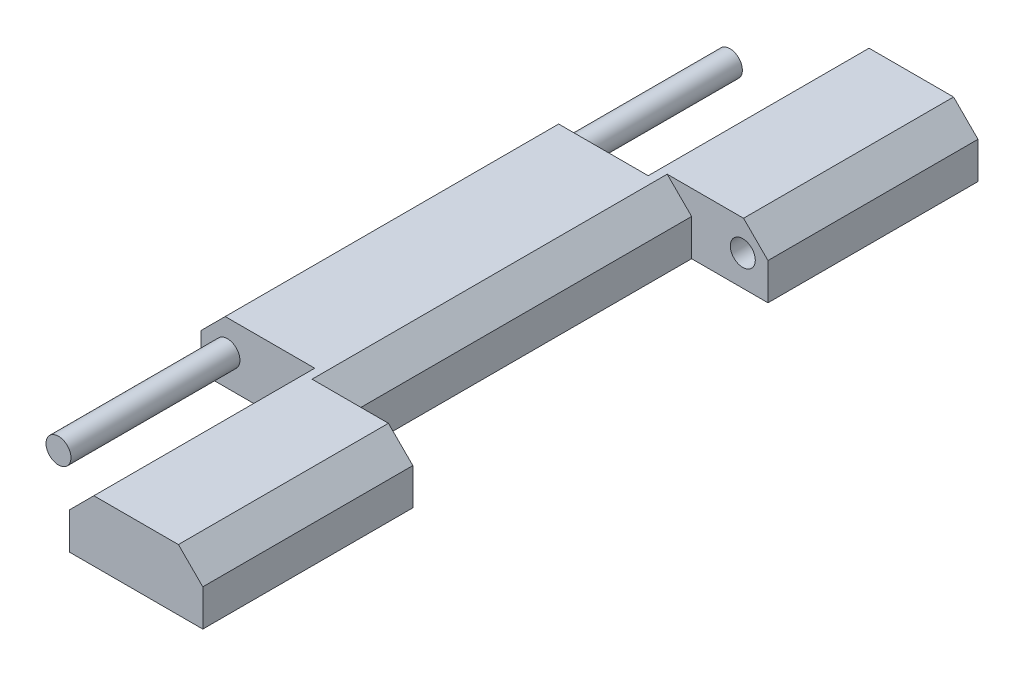
ISO-10303-21;
HEADER;
FILE_DESCRIPTION(('STEP AP214'),'2;1');
FILE_NAME('part.step','',(''),(''),'','','');
FILE_SCHEMA(('AUTOMOTIVE_DESIGN { 1 0 10303 214 1 1 1 1 }'));
ENDSEC;
DATA;
#1=APPLICATION_CONTEXT('core data for automotive mechanical design processes');
#2=APPLICATION_PROTOCOL_DEFINITION('international standard','automotive_design',2000,#1);
#3=PRODUCT_CONTEXT('',#1,'mechanical');
#4=PRODUCT('Part','Part','',(#3));
#5=PRODUCT_RELATED_PRODUCT_CATEGORY('part','',(#4));
#6=PRODUCT_DEFINITION_FORMATION('','',#4);
#7=PRODUCT_DEFINITION_CONTEXT('part definition',#1,'design');
#8=PRODUCT_DEFINITION('design','',#6,#7);
#9=PRODUCT_DEFINITION_SHAPE('','',#8);
#10=(LENGTH_UNIT() NAMED_UNIT(*) SI_UNIT(.MILLI.,.METRE.));
#11=(NAMED_UNIT(*) PLANE_ANGLE_UNIT() SI_UNIT($,.RADIAN.));
#12=(NAMED_UNIT(*) SI_UNIT($,.STERADIAN.) SOLID_ANGLE_UNIT());
#13=UNCERTAINTY_MEASURE_WITH_UNIT(LENGTH_MEASURE(1.E-05),#10,'distance_accuracy_value','');
#14=(GEOMETRIC_REPRESENTATION_CONTEXT(3) GLOBAL_UNCERTAINTY_ASSIGNED_CONTEXT((#13)) GLOBAL_UNIT_ASSIGNED_CONTEXT((#10,
#11,#12)) REPRESENTATION_CONTEXT('',''));
#15=CARTESIAN_POINT('',(0.,0.,0.));
#16=DIRECTION('',(0.,0.,1.));
#17=DIRECTION('',(1.,0.,0.));
#18=AXIS2_PLACEMENT_3D('',#15,#16,#17);
#19=CARTESIAN_POINT('',(-6.13161438081057,5.92420723275193,42.8625));
#20=DIRECTION('',(0.,0.,-1.));
#21=DIRECTION('',(-1.,0.,0.));
#22=AXIS2_PLACEMENT_3D('',#19,#20,#21);
#23=PLANE('',#22);
#24=DIRECTION('',(0.,-1.,0.));
#25=VECTOR('',#24,1.);
#26=CARTESIAN_POINT('',(8.61607262485704,5.92420723275193,42.8625));
#27=LINE('',#26,#25);
#28=CARTESIAN_POINT('',(8.61607262485704,3.22420723275193,42.8625));
#29=VERTEX_POINT('',#28);
#30=CARTESIAN_POINT('',(8.61607262485704,-0.825792767248064,42.8625));
#31=VERTEX_POINT('',#30);
#32=EDGE_CURVE('E162',#29,#31,#27,.T.);
#33=ORIENTED_EDGE('',*,*,#32,.F.);
#34=DIRECTION('',(0.707106781186548,-0.707106781186548,0.));
#35=VECTOR('',#34,1.);
#36=CARTESIAN_POINT('',(5.91607262485758,5.92420723275139,42.8625));
#37=LINE('',#36,#35);
#38=CARTESIAN_POINT('',(5.91607262485704,5.92420723275193,42.8625));
#39=VERTEX_POINT('',#38);
#40=EDGE_CURVE('E279',#29,#39,#37,.F.);
#41=ORIENTED_EDGE('',*,*,#40,.T.);
#42=DIRECTION('',(1.,0.,0.));
#43=VECTOR('',#42,1.);
#44=CARTESIAN_POINT('',(-6.13161438081057,5.92420723275193,42.8625));
#45=LINE('',#44,#43);
#46=CARTESIAN_POINT('',(-3.43161438081057,5.92420723275193,42.8625));
#47=VERTEX_POINT('',#46);
#48=EDGE_CURVE('E224',#47,#39,#45,.T.);
#49=ORIENTED_EDGE('',*,*,#48,.F.);
#50=DIRECTION('',(0.707106781186548,0.707106781186548,0.));
#51=VECTOR('',#50,1.);
#52=CARTESIAN_POINT('',(-3.43161438081056,5.92420723275195,42.8625));
#53=LINE('',#52,#51);
#54=CARTESIAN_POINT('',(-6.13161438081057,3.22420723275193,42.8625));
#55=VERTEX_POINT('',#54);
#56=EDGE_CURVE('E277',#47,#55,#53,.F.);
#57=ORIENTED_EDGE('',*,*,#56,.T.);
#58=DIRECTION('',(0.,-1.,0.));
#59=VECTOR('',#58,1.);
#60=CARTESIAN_POINT('',(-6.13161438081057,5.92420723275193,42.8625));
#61=LINE('',#60,#59);
#62=CARTESIAN_POINT('',(-6.13161438081057,-0.825792767248064,42.8625));
#63=VERTEX_POINT('',#62);
#64=EDGE_CURVE('E186',#55,#63,#61,.T.);
#65=ORIENTED_EDGE('',*,*,#64,.T.);
#66=DIRECTION('',(1.,0.,0.));
#67=VECTOR('',#66,1.);
#68=CARTESIAN_POINT('',(-6.13161438081057,-0.825792767248064,42.8625));
#69=LINE('',#68,#67);
#70=EDGE_CURVE('E180',#63,#31,#69,.T.);
#71=ORIENTED_EDGE('',*,*,#70,.T.);
#72=EDGE_LOOP('',(#33,#41,#49,#57,#65,#71));
#73=FACE_BOUND('',#72,.T.);
#74=ADVANCED_FACE('F35',(#73),#23,.F.);
#75=CARTESIAN_POINT('',(8.61607262485762,5.92420723275193,19.6362347014294));
#76=DIRECTION('',(-1.,0.,0.));
#77=DIRECTION('',(0.,0.,1.));
#78=AXIS2_PLACEMENT_3D('',#75,#76,#77);
#79=PLANE('',#78);
#80=DIRECTION('',(0.,-1.,0.));
#81=VECTOR('',#80,1.);
#82=CARTESIAN_POINT('',(8.61607262485762,5.92420723275193,19.6362347014294));
#83=LINE('',#82,#81);
#84=CARTESIAN_POINT('',(8.61607262485762,3.22420723275193,19.6362347014294));
#85=VERTEX_POINT('',#84);
#86=CARTESIAN_POINT('',(8.61607262485762,-0.825792767248064,19.6362347014294));
#87=VERTEX_POINT('',#86);
#88=EDGE_CURVE('E174',#85,#87,#83,.T.);
#89=ORIENTED_EDGE('',*,*,#88,.F.);
#90=DIRECTION('',(0.,0.,1.));
#91=VECTOR('',#90,1.);
#92=CARTESIAN_POINT('',(8.61607262485762,3.22420723275193,19.6362347014294));
#93=LINE('',#92,#91);
#94=EDGE_CURVE('E169',#85,#29,#93,.T.);
#95=ORIENTED_EDGE('',*,*,#94,.T.);
#96=ORIENTED_EDGE('',*,*,#32,.T.);
#97=DIRECTION('',(0.,0.,-1.));
#98=VECTOR('',#97,1.);
#99=CARTESIAN_POINT('',(8.61607262485762,-0.825792767248064,19.6362347014294));
#100=LINE('',#99,#98);
#101=EDGE_CURVE('E166',#31,#87,#100,.T.);
#102=ORIENTED_EDGE('',*,*,#101,.T.);
#103=EDGE_LOOP('',(#89,#95,#96,#102));
#104=FACE_BOUND('',#103,.T.);
#105=ADVANCED_FACE('F165',(#104),#79,.F.);
#106=CARTESIAN_POINT('',(8.61607262485762,5.92420723275193,19.6362347014294));
#107=DIRECTION('',(0.,0.,1.));
#108=DIRECTION('',(1.,0.,0.));
#109=AXIS2_PLACEMENT_3D('',#106,#107,#108);
#110=PLANE('',#109);
#111=CARTESIAN_POINT('',(5.8326217708247,2.54920723275193,19.6362347014294));
#112=DIRECTION('',(0.,0.,1.));
#113=DIRECTION('',(1.,0.,0.));
#114=AXIS2_PLACEMENT_3D('',#111,#112,#113);
#115=CIRCLE('',#114,1.37928339962338);
#116=CARTESIAN_POINT('',(7.21190517044808,2.54920723275193,19.6362347014294));
#117=VERTEX_POINT('',#116);
#118=EDGE_CURVE('E302',#117,#117,#115,.F.);
#119=ORIENTED_EDGE('',*,*,#118,.F.);
#120=EDGE_LOOP('',(#119));
#121=FACE_BOUND('',#120,.T.);
#122=DIRECTION('',(-1.,0.,0.));
#123=VECTOR('',#122,1.);
#124=CARTESIAN_POINT('',(8.61607262485762,5.92420723275193,19.6362347014294));
#125=LINE('',#124,#123);
#126=CARTESIAN_POINT('',(5.91607262485761,5.92420723275193,19.6362347014294));
#127=VERTEX_POINT('',#126);
#128=CARTESIAN_POINT('',(-2.52710417271163,5.92420723275193,19.6362347014294));
#129=VERTEX_POINT('',#128);
#130=EDGE_CURVE('E309',#127,#129,#125,.T.);
#131=ORIENTED_EDGE('',*,*,#130,.F.);
#132=DIRECTION('',(-0.707106781186548,0.707106781186548,0.));
#133=VECTOR('',#132,1.);
#134=CARTESIAN_POINT('',(5.91607262485786,5.92420723275169,19.6362347014294));
#135=LINE('',#134,#133);
#136=EDGE_CURVE('E274',#127,#85,#135,.F.);
#137=ORIENTED_EDGE('',*,*,#136,.T.);
#138=ORIENTED_EDGE('',*,*,#88,.T.);
#139=DIRECTION('',(-1.,0.,0.));
#140=VECTOR('',#139,1.);
#141=CARTESIAN_POINT('',(8.61607262485762,-0.825792767248064,19.6362347014294));
#142=LINE('',#141,#140);
#143=CARTESIAN_POINT('',(0.172895827288381,-0.825792767248064,19.6362347014294));
#144=VERTEX_POINT('',#143);
#145=EDGE_CURVE('E183',#87,#144,#142,.T.);
#146=ORIENTED_EDGE('',*,*,#145,.T.);
#147=DIRECTION('',(0.,-1.,0.));
#148=VECTOR('',#147,1.);
#149=CARTESIAN_POINT('',(0.172895827288381,5.92420723275193,19.6362347014294));
#150=LINE('',#149,#148);
#151=CARTESIAN_POINT('',(0.172895827288381,3.22420723275191,19.6362347014294));
#152=VERTEX_POINT('',#151);
#153=EDGE_CURVE('E242',#152,#144,#150,.T.);
#154=ORIENTED_EDGE('',*,*,#153,.F.);
#155=DIRECTION('',(0.707106781186546,-0.707106781186549,0.));
#156=VECTOR('',#155,1.);
#157=CARTESIAN_POINT('',(3.04448422607298,0.352618833967311,19.6362347014294));
#158=LINE('',#157,#156);
#159=EDGE_CURVE('E44',#152,#129,#158,.F.);
#160=ORIENTED_EDGE('',*,*,#159,.T.);
#161=EDGE_LOOP('',(#131,#137,#138,#146,#154,#160));
#162=FACE_BOUND('',#161,.T.);
#163=ADVANCED_FACE('F368',(#121,#162),#110,.F.);
#164=CARTESIAN_POINT('',(0.172895827288381,5.92420723275193,19.6362347014294));
#165=DIRECTION('',(-1.,0.,0.));
#166=DIRECTION('',(0.,0.,1.));
#167=AXIS2_PLACEMENT_3D('',#164,#165,#166);
#168=PLANE('',#167);
#169=DIRECTION('',(0.,-1.,0.));
#170=VECTOR('',#169,1.);
#171=CARTESIAN_POINT('',(0.172895827288381,5.92420723275193,-19.6362347014294));
#172=LINE('',#171,#170);
#173=CARTESIAN_POINT('',(0.172895827288381,3.22420723275191,-19.6362347014294));
#174=VERTEX_POINT('',#173);
#175=CARTESIAN_POINT('',(0.172895827288381,-0.825792767248064,-19.6362347014294));
#176=VERTEX_POINT('',#175);
#177=EDGE_CURVE('E240',#174,#176,#172,.T.);
#178=ORIENTED_EDGE('',*,*,#177,.F.);
#179=DIRECTION('',(0.,0.,1.));
#180=VECTOR('',#179,1.);
#181=CARTESIAN_POINT('',(0.172895827288381,3.22420723275191,19.6362347014294));
#182=LINE('',#181,#180);
#183=EDGE_CURVE('E272',#174,#152,#182,.T.);
#184=ORIENTED_EDGE('',*,*,#183,.T.);
#185=ORIENTED_EDGE('',*,*,#153,.T.);
#186=DIRECTION('',(0.,0.,-1.));
#187=VECTOR('',#186,1.);
#188=CARTESIAN_POINT('',(0.172895827288381,-0.825792767248064,19.6362347014294));
#189=LINE('',#188,#187);
#190=EDGE_CURVE('E198',#144,#176,#189,.T.);
#191=ORIENTED_EDGE('',*,*,#190,.T.);
#192=EDGE_LOOP('',(#178,#184,#185,#191));
#193=FACE_BOUND('',#192,.T.);
#194=ADVANCED_FACE('F363',(#193),#168,.F.);
#195=CARTESIAN_POINT('',(8.61607262485761,5.92420723275193,-19.6362347014294));
#196=DIRECTION('',(0.,0.,-1.));
#197=DIRECTION('',(-1.,0.,0.));
#198=AXIS2_PLACEMENT_3D('',#195,#196,#197);
#199=PLANE('',#198);
#200=CARTESIAN_POINT('',(5.8326217708247,2.54920723275193,-19.6362347014294));
#201=DIRECTION('',(0.,0.,-1.));
#202=DIRECTION('',(-1.,0.,0.));
#203=AXIS2_PLACEMENT_3D('',#200,#201,#202);
#204=CIRCLE('',#203,1.37928339962338);
#205=CARTESIAN_POINT('',(4.45333837120131,2.54920723275193,-19.6362347014294));
#206=VERTEX_POINT('',#205);
#207=EDGE_CURVE('E39',#206,#206,#204,.F.);
#208=ORIENTED_EDGE('',*,*,#207,.F.);
#209=EDGE_LOOP('',(#208));
#210=FACE_BOUND('',#209,.T.);
#211=DIRECTION('',(0.,-1.,0.));
#212=VECTOR('',#211,1.);
#213=CARTESIAN_POINT('',(8.61607262485761,5.92420723275193,-19.6362347014294));
#214=LINE('',#213,#212);
#215=CARTESIAN_POINT('',(8.61607262485761,3.22420723275191,-19.6362347014294));
#216=VERTEX_POINT('',#215);
#217=CARTESIAN_POINT('',(8.61607262485761,-0.825792767248064,-19.6362347014294));
#218=VERTEX_POINT('',#217);
#219=EDGE_CURVE('E238',#216,#218,#214,.T.);
#220=ORIENTED_EDGE('',*,*,#219,.F.);
#221=DIRECTION('',(0.707106781186546,-0.707106781186549,0.));
#222=VECTOR('',#221,1.);
#223=CARTESIAN_POINT('',(5.91607262485785,5.92420723275168,-19.6362347014294));
#224=LINE('',#223,#222);
#225=CARTESIAN_POINT('',(5.9160726248576,5.92420723275193,-19.6362347014294));
#226=VERTEX_POINT('',#225);
#227=EDGE_CURVE('E268',#216,#226,#224,.F.);
#228=ORIENTED_EDGE('',*,*,#227,.T.);
#229=DIRECTION('',(1.,0.,0.));
#230=VECTOR('',#229,1.);
#231=CARTESIAN_POINT('',(8.61607262485761,5.92420723275193,-19.6362347014294));
#232=LINE('',#231,#230);
#233=CARTESIAN_POINT('',(-2.52710417271163,5.92420723275193,-19.6362347014294));
#234=VERTEX_POINT('',#233);
#235=EDGE_CURVE('E311',#234,#226,#232,.T.);
#236=ORIENTED_EDGE('',*,*,#235,.F.);
#237=DIRECTION('',(-0.707106781186546,0.707106781186549,0.));
#238=VECTOR('',#237,1.);
#239=CARTESIAN_POINT('',(3.04448422607297,0.352618833967311,-19.6362347014294));
#240=LINE('',#239,#238);
#241=EDGE_CURVE('E289',#234,#174,#240,.F.);
#242=ORIENTED_EDGE('',*,*,#241,.T.);
#243=ORIENTED_EDGE('',*,*,#177,.T.);
#244=DIRECTION('',(1.,0.,0.));
#245=VECTOR('',#244,1.);
#246=CARTESIAN_POINT('',(8.61607262485761,-0.825792767248064,-19.6362347014294));
#247=LINE('',#246,#245);
#248=EDGE_CURVE('E201',#176,#218,#247,.T.);
#249=ORIENTED_EDGE('',*,*,#248,.T.);
#250=EDGE_LOOP('',(#220,#228,#236,#242,#243,#249));
#251=FACE_BOUND('',#250,.T.);
#252=ADVANCED_FACE('F357',(#210,#251),#199,.F.);
#253=CARTESIAN_POINT('',(8.61607262485703,5.92420723275193,-42.8625));
#254=DIRECTION('',(-1.,0.,0.));
#255=DIRECTION('',(0.,0.,1.));
#256=AXIS2_PLACEMENT_3D('',#253,#254,#255);
#257=PLANE('',#256);
#258=DIRECTION('',(0.,-1.,0.));
#259=VECTOR('',#258,1.);
#260=CARTESIAN_POINT('',(8.61607262485703,5.92420723275193,-42.8625));
#261=LINE('',#260,#259);
#262=CARTESIAN_POINT('',(8.61607262485703,3.22420723275191,-42.8625));
#263=VERTEX_POINT('',#262);
#264=CARTESIAN_POINT('',(8.61607262485703,-0.825792767248064,-42.8625));
#265=VERTEX_POINT('',#264);
#266=EDGE_CURVE('E236',#263,#265,#261,.T.);
#267=ORIENTED_EDGE('',*,*,#266,.F.);
#268=DIRECTION('',(0.,0.,1.));
#269=VECTOR('',#268,1.);
#270=CARTESIAN_POINT('',(8.61607262485703,3.22420723275191,-42.8625));
#271=LINE('',#270,#269);
#272=EDGE_CURVE('E266',#263,#216,#271,.T.);
#273=ORIENTED_EDGE('',*,*,#272,.T.);
#274=ORIENTED_EDGE('',*,*,#219,.T.);
#275=DIRECTION('',(0.,0.,-1.));
#276=VECTOR('',#275,1.);
#277=CARTESIAN_POINT('',(8.61607262485703,-0.825792767248064,-42.8625));
#278=LINE('',#277,#276);
#279=EDGE_CURVE('E204',#218,#265,#278,.T.);
#280=ORIENTED_EDGE('',*,*,#279,.T.);
#281=EDGE_LOOP('',(#267,#273,#274,#280));
#282=FACE_BOUND('',#281,.T.);
#283=ADVANCED_FACE('F353',(#282),#257,.F.);
#284=CARTESIAN_POINT('',(-6.13161438081057,5.92420723275193,-42.8625));
#285=DIRECTION('',(0.,0.,1.));
#286=DIRECTION('',(1.,0.,0.));
#287=AXIS2_PLACEMENT_3D('',#284,#285,#286);
#288=PLANE('',#287);
#289=DIRECTION('',(-1.,0.,0.));
#290=VECTOR('',#289,1.);
#291=CARTESIAN_POINT('',(-6.13161438081057,5.92420723275193,-42.8625));
#292=LINE('',#291,#290);
#293=CARTESIAN_POINT('',(5.91607262485702,5.92420723275193,-42.8625));
#294=VERTEX_POINT('',#293);
#295=CARTESIAN_POINT('',(-3.43161438081056,5.92420723275193,-42.8625));
#296=VERTEX_POINT('',#295);
#297=EDGE_CURVE('E314',#294,#296,#292,.T.);
#298=ORIENTED_EDGE('',*,*,#297,.F.);
#299=DIRECTION('',(-0.707106781186546,0.707106781186549,0.));
#300=VECTOR('',#299,1.);
#301=CARTESIAN_POINT('',(5.91607262485754,5.92420723275141,-42.8625));
#302=LINE('',#301,#300);
#303=EDGE_CURVE('E264',#294,#263,#302,.F.);
#304=ORIENTED_EDGE('',*,*,#303,.T.);
#305=ORIENTED_EDGE('',*,*,#266,.T.);
#306=DIRECTION('',(-1.,0.,0.));
#307=VECTOR('',#306,1.);
#308=CARTESIAN_POINT('',(-6.13161438081057,-0.825792767248064,-42.8625));
#309=LINE('',#308,#307);
#310=CARTESIAN_POINT('',(-6.13161438081057,-0.825792767248064,-42.8625));
#311=VERTEX_POINT('',#310);
#312=EDGE_CURVE('E207',#265,#311,#309,.T.);
#313=ORIENTED_EDGE('',*,*,#312,.T.);
#314=DIRECTION('',(0.,-1.,0.));
#315=VECTOR('',#314,1.);
#316=CARTESIAN_POINT('',(-6.13161438081057,5.92420723275193,-42.8625));
#317=LINE('',#316,#315);
#318=CARTESIAN_POINT('',(-6.13161438081057,3.22420723275191,-42.8625));
#319=VERTEX_POINT('',#318);
#320=EDGE_CURVE('E234',#319,#311,#317,.T.);
#321=ORIENTED_EDGE('',*,*,#320,.F.);
#322=DIRECTION('',(-0.707106781186546,-0.707106781186549,0.));
#323=VECTOR('',#322,1.);
#324=CARTESIAN_POINT('',(-3.43161438081058,5.92420723275191,-42.8625));
#325=LINE('',#324,#323);
#326=EDGE_CURVE('E262',#319,#296,#325,.F.);
#327=ORIENTED_EDGE('',*,*,#326,.T.);
#328=EDGE_LOOP('',(#298,#304,#305,#313,#321,#327));
#329=FACE_BOUND('',#328,.T.);
#330=ADVANCED_FACE('F349',(#329),#288,.F.);
#331=CARTESIAN_POINT('',(-6.13161438081057,5.92420723275193,-42.8625));
#332=DIRECTION('',(1.,0.,0.));
#333=DIRECTION('',(0.,0.,-1.));
#334=AXIS2_PLACEMENT_3D('',#331,#332,#333);
#335=PLANE('',#334);
#336=DIRECTION('',(0.,-1.,0.));
#337=VECTOR('',#336,1.);
#338=CARTESIAN_POINT('',(-6.13161438081058,5.92420723275193,-18.4379950481214));
#339=LINE('',#338,#337);
#340=CARTESIAN_POINT('',(-6.13161438081058,3.22420723275191,-18.4379950481214));
#341=VERTEX_POINT('',#340);
#342=CARTESIAN_POINT('',(-6.13161438081058,-0.825792767248064,-18.4379950481214));
#343=VERTEX_POINT('',#342);
#344=EDGE_CURVE('E232',#341,#343,#339,.T.);
#345=ORIENTED_EDGE('',*,*,#344,.F.);
#346=DIRECTION('',(0.,0.,-1.));
#347=VECTOR('',#346,1.);
#348=CARTESIAN_POINT('',(-6.13161438081057,3.22420723275191,-42.8625));
#349=LINE('',#348,#347);
#350=EDGE_CURVE('E270',#341,#319,#349,.T.);
#351=ORIENTED_EDGE('',*,*,#350,.T.);
#352=ORIENTED_EDGE('',*,*,#320,.T.);
#353=DIRECTION('',(0.,0.,1.));
#354=VECTOR('',#353,1.);
#355=CARTESIAN_POINT('',(-6.13161438081057,-0.825792767248064,-42.8625));
#356=LINE('',#355,#354);
#357=EDGE_CURVE('E210',#311,#343,#356,.T.);
#358=ORIENTED_EDGE('',*,*,#357,.T.);
#359=EDGE_LOOP('',(#345,#351,#352,#358));
#360=FACE_BOUND('',#359,.T.);
#361=ADVANCED_FACE('F343',(#360),#335,.F.);
#362=CARTESIAN_POINT('',(-16.0321087449545,5.92420723275193,-18.4379950481215));
#363=DIRECTION('',(0.,0.,1.));
#364=DIRECTION('',(1.,0.,0.));
#365=AXIS2_PLACEMENT_3D('',#362,#363,#364);
#366=PLANE('',#365);
#367=CARTESIAN_POINT('',(-13.0836136147864,2.54920723275193,-18.4379950481215));
#368=DIRECTION('',(0.,0.,1.));
#369=DIRECTION('',(1.,0.,0.));
#370=AXIS2_PLACEMENT_3D('',#367,#368,#369);
#371=CIRCLE('',#370,1.37928339962338);
#372=CARTESIAN_POINT('',(-11.7043302151631,2.54920723275193,-18.4379950481215));
#373=VERTEX_POINT('',#372);
#374=EDGE_CURVE('E188',#373,#373,#371,.T.);
#375=ORIENTED_EDGE('',*,*,#374,.T.);
#376=EDGE_LOOP('',(#375));
#377=FACE_BOUND('',#376,.T.);
#378=DIRECTION('',(0.,-1.,0.));
#379=VECTOR('',#378,1.);
#380=CARTESIAN_POINT('',(-16.0321087449545,5.92420723275193,-18.4379950481215));
#381=LINE('',#380,#379);
#382=CARTESIAN_POINT('',(-16.0321087449545,3.22420723275191,-18.4379950481215));
#383=VERTEX_POINT('',#382);
#384=CARTESIAN_POINT('',(-16.0321087449545,-0.825792767248064,-18.4379950481215));
#385=VERTEX_POINT('',#384);
#386=EDGE_CURVE('E230',#383,#385,#381,.T.);
#387=ORIENTED_EDGE('',*,*,#386,.F.);
#388=DIRECTION('',(-0.707106781186546,-0.707106781186549,0.));
#389=VECTOR('',#388,1.);
#390=CARTESIAN_POINT('',(-13.3321087449546,5.9242072327519,-18.4379950481215));
#391=LINE('',#390,#389);
#392=CARTESIAN_POINT('',(-13.3321087449545,5.92420723275193,-18.4379950481215));
#393=VERTEX_POINT('',#392);
#394=EDGE_CURVE('E285',#383,#393,#391,.F.);
#395=ORIENTED_EDGE('',*,*,#394,.T.);
#396=DIRECTION('',(-1.,0.,0.));
#397=VECTOR('',#396,1.);
#398=CARTESIAN_POINT('',(-16.0321087449545,5.92420723275193,-18.4379950481215));
#399=LINE('',#398,#397);
#400=CARTESIAN_POINT('',(-3.43161438081058,5.92420723275193,-18.4379950481214));
#401=VERTEX_POINT('',#400);
#402=EDGE_CURVE('E316',#401,#393,#399,.T.);
#403=ORIENTED_EDGE('',*,*,#402,.F.);
#404=DIRECTION('',(0.707106781186546,0.707106781186549,0.));
#405=VECTOR('',#404,1.);
#406=CARTESIAN_POINT('',(-9.73186156288253,-0.376039949320052,-18.4379950481215));
#407=LINE('',#406,#405);
#408=EDGE_CURVE('E287',#401,#341,#407,.F.);
#409=ORIENTED_EDGE('',*,*,#408,.T.);
#410=ORIENTED_EDGE('',*,*,#344,.T.);
#411=DIRECTION('',(-1.,0.,0.));
#412=VECTOR('',#411,1.);
#413=CARTESIAN_POINT('',(-16.0321087449545,-0.825792767248064,-18.4379950481215));
#414=LINE('',#413,#412);
#415=EDGE_CURVE('E213',#343,#385,#414,.T.);
#416=ORIENTED_EDGE('',*,*,#415,.T.);
#417=EDGE_LOOP('',(#387,#395,#403,#409,#410,#416));
#418=FACE_BOUND('',#417,.T.);
#419=ADVANCED_FACE('F337',(#377,#418),#366,.F.);
#420=CARTESIAN_POINT('',(-16.0321087449545,5.92420723275193,-18.4379950481215));
#421=DIRECTION('',(1.,0.,0.));
#422=DIRECTION('',(0.,0.,-1.));
#423=AXIS2_PLACEMENT_3D('',#420,#421,#422);
#424=PLANE('',#423);
#425=DIRECTION('',(0.,-1.,0.));
#426=VECTOR('',#425,1.);
#427=CARTESIAN_POINT('',(-16.0321087449549,5.92420723275193,18.4379950481214));
#428=LINE('',#427,#426);
#429=CARTESIAN_POINT('',(-16.0321087449549,3.22420723275191,18.4379950481214));
#430=VERTEX_POINT('',#429);
#431=CARTESIAN_POINT('',(-16.0321087449549,-0.825792767248064,18.4379950481214));
#432=VERTEX_POINT('',#431);
#433=EDGE_CURVE('E228',#430,#432,#428,.T.);
#434=ORIENTED_EDGE('',*,*,#433,.F.);
#435=DIRECTION('',(0.,0.,-1.));
#436=VECTOR('',#435,1.);
#437=CARTESIAN_POINT('',(-16.0321087449545,3.22420723275191,-18.4379950481215));
#438=LINE('',#437,#436);
#439=EDGE_CURVE('E52',#430,#383,#438,.T.);
#440=ORIENTED_EDGE('',*,*,#439,.T.);
#441=ORIENTED_EDGE('',*,*,#386,.T.);
#442=DIRECTION('',(0.,0.,1.));
#443=VECTOR('',#442,1.);
#444=CARTESIAN_POINT('',(-16.0321087449545,-0.825792767248064,-18.4379950481215));
#445=LINE('',#444,#443);
#446=EDGE_CURVE('E216',#385,#432,#445,.T.);
#447=ORIENTED_EDGE('',*,*,#446,.T.);
#448=EDGE_LOOP('',(#434,#440,#441,#447));
#449=FACE_BOUND('',#448,.T.);
#450=ADVANCED_FACE('F334',(#449),#424,.F.);
#451=CARTESIAN_POINT('',(-16.0321087449549,5.92420723275193,18.4379950481214));
#452=DIRECTION('',(0.,0.,-1.));
#453=DIRECTION('',(-1.,0.,0.));
#454=AXIS2_PLACEMENT_3D('',#451,#452,#453);
#455=PLANE('',#454);
#456=CARTESIAN_POINT('',(-13.0836136147864,2.54920723275193,18.4379950481214));
#457=DIRECTION('',(0.,0.,-1.));
#458=DIRECTION('',(-1.,0.,0.));
#459=AXIS2_PLACEMENT_3D('',#456,#457,#458);
#460=CIRCLE('',#459,1.37928339962338);
#461=CARTESIAN_POINT('',(-14.4628970144098,2.54920723275193,18.4379950481214));
#462=VERTEX_POINT('',#461);
#463=EDGE_CURVE('E191',#462,#462,#460,.T.);
#464=ORIENTED_EDGE('',*,*,#463,.T.);
#465=EDGE_LOOP('',(#464));
#466=FACE_BOUND('',#465,.T.);
#467=DIRECTION('',(1.,0.,0.));
#468=VECTOR('',#467,1.);
#469=CARTESIAN_POINT('',(-16.0321087449549,5.92420723275193,18.4379950481214));
#470=LINE('',#469,#468);
#471=CARTESIAN_POINT('',(-13.3321087449549,5.92420723275193,18.4379950481214));
#472=VERTEX_POINT('',#471);
#473=CARTESIAN_POINT('',(-3.43161438081057,5.92420723275193,18.4379950481214));
#474=VERTEX_POINT('',#473);
#475=EDGE_CURVE('E194',#472,#474,#470,.T.);
#476=ORIENTED_EDGE('',*,*,#475,.F.);
#477=DIRECTION('',(0.707106781186546,0.707106781186549,0.));
#478=VECTOR('',#477,1.);
#479=CARTESIAN_POINT('',(-13.3321087449548,5.92420723275199,18.4379950481214));
#480=LINE('',#479,#478);
#481=EDGE_CURVE('E60',#472,#430,#480,.F.);
#482=ORIENTED_EDGE('',*,*,#481,.T.);
#483=ORIENTED_EDGE('',*,*,#433,.T.);
#484=DIRECTION('',(1.,0.,0.));
#485=VECTOR('',#484,1.);
#486=CARTESIAN_POINT('',(-16.0321087449549,-0.825792767248064,18.4379950481214));
#487=LINE('',#486,#485);
#488=CARTESIAN_POINT('',(-6.13161438081057,-0.825792767248064,18.4379950481214));
#489=VERTEX_POINT('',#488);
#490=EDGE_CURVE('E219',#432,#489,#487,.T.);
#491=ORIENTED_EDGE('',*,*,#490,.T.);
#492=DIRECTION('',(0.,-1.,0.));
#493=VECTOR('',#492,1.);
#494=CARTESIAN_POINT('',(-6.13161438081057,5.92420723275193,18.4379950481214));
#495=LINE('',#494,#493);
#496=CARTESIAN_POINT('',(-6.13161438081057,3.22420723275193,18.4379950481214));
#497=VERTEX_POINT('',#496);
#498=EDGE_CURVE('E226',#497,#489,#495,.T.);
#499=ORIENTED_EDGE('',*,*,#498,.F.);
#500=DIRECTION('',(-0.707106781186548,-0.707106781186548,0.));
#501=VECTOR('',#500,1.);
#502=CARTESIAN_POINT('',(-9.73186156288273,-0.376039949320231,18.4379950481214));
#503=LINE('',#502,#501);
#504=EDGE_CURVE('E11',#497,#474,#503,.F.);
#505=ORIENTED_EDGE('',*,*,#504,.T.);
#506=EDGE_LOOP('',(#476,#482,#483,#491,#499,#505));
#507=FACE_BOUND('',#506,.T.);
#508=ADVANCED_FACE('F325',(#466,#507),#455,.F.);
#509=CARTESIAN_POINT('',(-6.13161438081057,5.92420723275193,18.4379950481214));
#510=DIRECTION('',(1.,0.,0.));
#511=DIRECTION('',(0.,0.,-1.));
#512=AXIS2_PLACEMENT_3D('',#509,#510,#511);
#513=PLANE('',#512);
#514=ORIENTED_EDGE('',*,*,#64,.F.);
#515=DIRECTION('',(0.,0.,-1.));
#516=VECTOR('',#515,1.);
#517=CARTESIAN_POINT('',(-6.13161438081057,3.22420723275193,18.4379950481214));
#518=LINE('',#517,#516);
#519=EDGE_CURVE('E281',#55,#497,#518,.T.);
#520=ORIENTED_EDGE('',*,*,#519,.T.);
#521=ORIENTED_EDGE('',*,*,#498,.T.);
#522=DIRECTION('',(0.,0.,1.));
#523=VECTOR('',#522,1.);
#524=CARTESIAN_POINT('',(-6.13161438081057,-0.825792767248064,18.4379950481214));
#525=LINE('',#524,#523);
#526=EDGE_CURVE('E222',#489,#63,#525,.T.);
#527=ORIENTED_EDGE('',*,*,#526,.T.);
#528=EDGE_LOOP('',(#514,#520,#521,#527));
#529=FACE_BOUND('',#528,.T.);
#530=ADVANCED_FACE('F330',(#529),#513,.F.);
#531=CARTESIAN_POINT('',(1.24222912202352,5.92420723275193,0.));
#532=DIRECTION('',(0.,-1.,0.));
#533=DIRECTION('',(0.,0.,-1.));
#534=AXIS2_PLACEMENT_3D('',#531,#532,#533);
#535=PLANE('',#534);
#536=ORIENTED_EDGE('',*,*,#235,.T.);
#537=DIRECTION('',(0.,0.,-1.));
#538=VECTOR('',#537,1.);
#539=CARTESIAN_POINT('',(5.91607262485809,5.92420723275193,-1.2693319779243E-13));
#540=LINE('',#539,#538);
#541=EDGE_CURVE('E259',#226,#294,#540,.T.);
#542=ORIENTED_EDGE('',*,*,#541,.T.);
#543=ORIENTED_EDGE('',*,*,#297,.T.);
#544=DIRECTION('',(0.,0.,1.));
#545=VECTOR('',#544,1.);
#546=CARTESIAN_POINT('',(-3.43161438081058,5.92420723275193,0.));
#547=LINE('',#546,#545);
#548=EDGE_CURVE('E256',#296,#401,#547,.T.);
#549=ORIENTED_EDGE('',*,*,#548,.T.);
#550=ORIENTED_EDGE('',*,*,#402,.T.);
#551=DIRECTION('',(0.,0.,1.));
#552=VECTOR('',#551,1.);
#553=CARTESIAN_POINT('',(-13.3321087449547,5.92420723275193,-1.50512172245589E-13));
#554=LINE('',#553,#552);
#555=EDGE_CURVE('E173',#393,#472,#554,.T.);
#556=ORIENTED_EDGE('',*,*,#555,.T.);
#557=ORIENTED_EDGE('',*,*,#475,.T.);
#558=DIRECTION('',(0.,0.,1.));
#559=VECTOR('',#558,1.);
#560=CARTESIAN_POINT('',(-3.43161438081057,5.92420723275193,0.));
#561=LINE('',#560,#559);
#562=EDGE_CURVE('E247',#474,#47,#561,.T.);
#563=ORIENTED_EDGE('',*,*,#562,.T.);
#564=ORIENTED_EDGE('',*,*,#48,.T.);
#565=DIRECTION('',(0.,0.,-1.));
#566=VECTOR('',#565,1.);
#567=CARTESIAN_POINT('',(5.9160726248581,5.92420723275193,1.0539703509202E-13));
#568=LINE('',#567,#566);
#569=EDGE_CURVE('E250',#39,#127,#568,.T.);
#570=ORIENTED_EDGE('',*,*,#569,.T.);
#571=ORIENTED_EDGE('',*,*,#130,.T.);
#572=DIRECTION('',(0.,0.,-1.));
#573=VECTOR('',#572,1.);
#574=CARTESIAN_POINT('',(-2.52710417271163,5.92420723275193,0.));
#575=LINE('',#574,#573);
#576=EDGE_CURVE('E253',#129,#234,#575,.T.);
#577=ORIENTED_EDGE('',*,*,#576,.T.);
#578=EDGE_LOOP('',(#536,#542,#543,#549,#550,#556,#557,#563,#564,#570,#571,#577));
#579=FACE_BOUND('',#578,.T.);
#580=ADVANCED_FACE('F320',(#579),#535,.F.);
#581=CARTESIAN_POINT('',(1.24222912202352,-0.825792767248064,0.));
#582=DIRECTION('',(0.,-1.,0.));
#583=DIRECTION('',(0.,0.,-1.));
#584=AXIS2_PLACEMENT_3D('',#581,#582,#583);
#585=PLANE('',#584);
#586=ORIENTED_EDGE('',*,*,#70,.F.);
#587=ORIENTED_EDGE('',*,*,#526,.F.);
#588=ORIENTED_EDGE('',*,*,#490,.F.);
#589=ORIENTED_EDGE('',*,*,#446,.F.);
#590=ORIENTED_EDGE('',*,*,#415,.F.);
#591=ORIENTED_EDGE('',*,*,#357,.F.);
#592=ORIENTED_EDGE('',*,*,#312,.F.);
#593=ORIENTED_EDGE('',*,*,#279,.F.);
#594=ORIENTED_EDGE('',*,*,#248,.F.);
#595=ORIENTED_EDGE('',*,*,#190,.F.);
#596=ORIENTED_EDGE('',*,*,#145,.F.);
#597=ORIENTED_EDGE('',*,*,#101,.F.);
#598=EDGE_LOOP('',(#586,#587,#588,#589,#590,#591,#592,#593,#594,#595,#596,#597));
#599=FACE_BOUND('',#598,.T.);
#600=ADVANCED_FACE('F178',(#599),#585,.T.);
#601=CARTESIAN_POINT('',(5.91607262485809,5.92420723275193,-1.2693319779243E-13));
#602=DIRECTION('',(-0.707106781186549,-0.707106781186546,0.));
#603=DIRECTION('',(0.,0.,-1.));
#604=AXIS2_PLACEMENT_3D('',#601,#602,#603);
#605=PLANE('',#604);
#606=ORIENTED_EDGE('',*,*,#227,.F.);
#607=ORIENTED_EDGE('',*,*,#272,.F.);
#608=ORIENTED_EDGE('',*,*,#303,.F.);
#609=ORIENTED_EDGE('',*,*,#541,.F.);
#610=EDGE_LOOP('',(#606,#607,#608,#609));
#611=FACE_BOUND('',#610,.T.);
#612=ADVANCED_FACE('F377',(#611),#605,.F.);
#613=CARTESIAN_POINT('',(-3.43161438081058,5.92420723275193,0.));
#614=DIRECTION('',(0.707106781186549,-0.707106781186546,0.));
#615=DIRECTION('',(0.,0.,1.));
#616=AXIS2_PLACEMENT_3D('',#613,#614,#615);
#617=PLANE('',#616);
#618=ORIENTED_EDGE('',*,*,#326,.F.);
#619=ORIENTED_EDGE('',*,*,#350,.F.);
#620=ORIENTED_EDGE('',*,*,#408,.F.);
#621=ORIENTED_EDGE('',*,*,#548,.F.);
#622=EDGE_LOOP('',(#618,#619,#620,#621));
#623=FACE_BOUND('',#622,.T.);
#624=ADVANCED_FACE('F379',(#623),#617,.F.);
#625=CARTESIAN_POINT('',(-2.52710417271163,5.92420723275193,0.));
#626=DIRECTION('',(-0.707106781186549,-0.707106781186546,0.));
#627=DIRECTION('',(0.,0.,-1.));
#628=AXIS2_PLACEMENT_3D('',#625,#626,#627);
#629=PLANE('',#628);
#630=ORIENTED_EDGE('',*,*,#159,.F.);
#631=ORIENTED_EDGE('',*,*,#183,.F.);
#632=ORIENTED_EDGE('',*,*,#241,.F.);
#633=ORIENTED_EDGE('',*,*,#576,.F.);
#634=EDGE_LOOP('',(#630,#631,#632,#633));
#635=FACE_BOUND('',#634,.T.);
#636=ADVANCED_FACE('F374',(#635),#629,.F.);
#637=CARTESIAN_POINT('',(5.9160726248581,5.92420723275193,1.0539703509202E-13));
#638=DIRECTION('',(-0.707106781186547,-0.707106781186547,0.));
#639=DIRECTION('',(0.,0.,-1.));
#640=AXIS2_PLACEMENT_3D('',#637,#638,#639);
#641=PLANE('',#640);
#642=ORIENTED_EDGE('',*,*,#40,.F.);
#643=ORIENTED_EDGE('',*,*,#94,.F.);
#644=ORIENTED_EDGE('',*,*,#136,.F.);
#645=ORIENTED_EDGE('',*,*,#569,.F.);
#646=EDGE_LOOP('',(#642,#643,#644,#645));
#647=FACE_BOUND('',#646,.T.);
#648=ADVANCED_FACE('F370',(#647),#641,.F.);
#649=CARTESIAN_POINT('',(-3.43161438081057,5.92420723275193,0.));
#650=DIRECTION('',(0.707106781186547,-0.707106781186547,0.));
#651=DIRECTION('',(0.,0.,1.));
#652=AXIS2_PLACEMENT_3D('',#649,#650,#651);
#653=PLANE('',#652);
#654=ORIENTED_EDGE('',*,*,#504,.F.);
#655=ORIENTED_EDGE('',*,*,#519,.F.);
#656=ORIENTED_EDGE('',*,*,#56,.F.);
#657=ORIENTED_EDGE('',*,*,#562,.F.);
#658=EDGE_LOOP('',(#654,#655,#656,#657));
#659=FACE_BOUND('',#658,.T.);
#660=ADVANCED_FACE('F328',(#659),#653,.F.);
#661=CARTESIAN_POINT('',(-13.3321087449547,5.92420723275193,-1.50512172245589E-13));
#662=DIRECTION('',(0.707106781186549,-0.707106781186546,0.));
#663=DIRECTION('',(0.,0.,1.));
#664=AXIS2_PLACEMENT_3D('',#661,#662,#663);
#665=PLANE('',#664);
#666=ORIENTED_EDGE('',*,*,#394,.F.);
#667=ORIENTED_EDGE('',*,*,#439,.F.);
#668=ORIENTED_EDGE('',*,*,#481,.F.);
#669=ORIENTED_EDGE('',*,*,#555,.F.);
#670=EDGE_LOOP('',(#666,#667,#668,#669));
#671=FACE_BOUND('',#670,.T.);
#672=ADVANCED_FACE('F37',(#671),#665,.F.);
#673=CARTESIAN_POINT('',(-13.0836136147864,2.54920723275193,37.1249999999999));
#674=DIRECTION('',(0.,0.,-1.));
#675=DIRECTION('',(-1.,0.,0.));
#676=AXIS2_PLACEMENT_3D('',#673,#674,#675);
#677=PLANE('',#676);
#678=CARTESIAN_POINT('',(-13.0836136147864,2.54920723275193,37.1249999999999));
#679=DIRECTION('',(0.,0.,-1.));
#680=DIRECTION('',(-1.,0.,0.));
#681=AXIS2_PLACEMENT_3D('',#678,#679,#680);
#682=CIRCLE('',#681,1.37928339962338);
#683=CARTESIAN_POINT('',(-14.4628970144098,2.54920723275193,37.1249999999999));
#684=VERTEX_POINT('',#683);
#685=EDGE_CURVE('E293',#684,#684,#682,.T.);
#686=ORIENTED_EDGE('',*,*,#685,.F.);
#687=EDGE_LOOP('',(#686));
#688=FACE_BOUND('',#687,.T.);
#689=ADVANCED_FACE('F430',(#688),#677,.F.);
#690=CARTESIAN_POINT('',(-13.0836136147864,2.54920723275193,37.1249999999999));
#691=DIRECTION('',(0.,0.,-1.));
#692=DIRECTION('',(-1.,0.,0.));
#693=AXIS2_PLACEMENT_3D('',#690,#691,#692);
#694=CYLINDRICAL_SURFACE('',#693,1.37928339962338);
#695=ORIENTED_EDGE('',*,*,#685,.T.);
#696=EDGE_LOOP('',(#695));
#697=FACE_BOUND('',#696,.T.);
#698=ORIENTED_EDGE('',*,*,#463,.F.);
#699=EDGE_LOOP('',(#698));
#700=FACE_BOUND('',#699,.T.);
#701=ADVANCED_FACE('F424',(#697,#700),#694,.T.);
#702=CARTESIAN_POINT('',(-13.0836136147864,2.54920723275193,-37.1250000000001));
#703=DIRECTION('',(0.,0.,-1.));
#704=DIRECTION('',(-1.,0.,0.));
#705=AXIS2_PLACEMENT_3D('',#702,#703,#704);
#706=CIRCLE('',#705,1.37928339962338);
#707=CARTESIAN_POINT('',(-14.4628970144098,2.54920723275193,-37.1250000000001));
#708=VERTEX_POINT('',#707);
#709=EDGE_CURVE('E297',#708,#708,#706,.T.);
#710=ORIENTED_EDGE('',*,*,#709,.F.);
#711=EDGE_LOOP('',(#710));
#712=FACE_BOUND('',#711,.T.);
#713=ORIENTED_EDGE('',*,*,#374,.F.);
#714=EDGE_LOOP('',(#713));
#715=FACE_BOUND('',#714,.T.);
#716=ADVANCED_FACE('F420',(#712,#715),#694,.T.);
#717=CARTESIAN_POINT('',(-13.0836136147864,2.54920723275193,-37.1250000000001));
#718=DIRECTION('',(0.,0.,-1.));
#719=DIRECTION('',(-1.,0.,0.));
#720=AXIS2_PLACEMENT_3D('',#717,#718,#719);
#721=PLANE('',#720);
#722=ORIENTED_EDGE('',*,*,#709,.T.);
#723=EDGE_LOOP('',(#722));
#724=FACE_BOUND('',#723,.T.);
#725=ADVANCED_FACE('F423',(#724),#721,.T.);
#726=CARTESIAN_POINT('',(5.8326217708247,2.54920723275193,-37.125));
#727=DIRECTION('',(0.,0.,-1.));
#728=DIRECTION('',(-1.,0.,0.));
#729=AXIS2_PLACEMENT_3D('',#726,#727,#728);
#730=PLANE('',#729);
#731=CARTESIAN_POINT('',(5.8326217708247,2.54920723275193,-37.125));
#732=DIRECTION('',(0.,0.,-1.));
#733=DIRECTION('',(-1.,0.,0.));
#734=AXIS2_PLACEMENT_3D('',#731,#732,#733);
#735=CIRCLE('',#734,1.37928339962338);
#736=CARTESIAN_POINT('',(4.45333837120131,2.54920723275193,-37.125));
#737=VERTEX_POINT('',#736);
#738=EDGE_CURVE('E451',#737,#737,#735,.T.);
#739=ORIENTED_EDGE('',*,*,#738,.F.);
#740=EDGE_LOOP('',(#739));
#741=FACE_BOUND('',#740,.T.);
#742=ADVANCED_FACE('F428',(#741),#730,.F.);
#743=CARTESIAN_POINT('',(5.8326217708247,2.54920723275193,-37.125));
#744=DIRECTION('',(0.,0.,1.));
#745=DIRECTION('',(1.,0.,0.));
#746=AXIS2_PLACEMENT_3D('',#743,#744,#745);
#747=CYLINDRICAL_SURFACE('',#746,1.37928339962338);
#748=ORIENTED_EDGE('',*,*,#738,.T.);
#749=EDGE_LOOP('',(#748));
#750=FACE_BOUND('',#749,.T.);
#751=ORIENTED_EDGE('',*,*,#207,.T.);
#752=EDGE_LOOP('',(#751));
#753=FACE_BOUND('',#752,.T.);
#754=ADVANCED_FACE('F438',(#750,#753),#747,.F.);
#755=CARTESIAN_POINT('',(5.8326217708247,2.54920723275193,37.125));
#756=DIRECTION('',(0.,0.,-1.));
#757=DIRECTION('',(-1.,0.,0.));
#758=AXIS2_PLACEMENT_3D('',#755,#756,#757);
#759=CIRCLE('',#758,1.37928339962338);
#760=CARTESIAN_POINT('',(4.45333837120131,2.54920723275193,37.125));
#761=VERTEX_POINT('',#760);
#762=EDGE_CURVE('E452',#761,#761,#759,.T.);
#763=ORIENTED_EDGE('',*,*,#762,.F.);
#764=EDGE_LOOP('',(#763));
#765=FACE_BOUND('',#764,.T.);
#766=ORIENTED_EDGE('',*,*,#118,.T.);
#767=EDGE_LOOP('',(#766));
#768=FACE_BOUND('',#767,.T.);
#769=ADVANCED_FACE('F434',(#765,#768),#747,.F.);
#770=CARTESIAN_POINT('',(5.8326217708247,2.54920723275193,37.125));
#771=DIRECTION('',(0.,0.,-1.));
#772=DIRECTION('',(-1.,0.,0.));
#773=AXIS2_PLACEMENT_3D('',#770,#771,#772);
#774=PLANE('',#773);
#775=ORIENTED_EDGE('',*,*,#762,.T.);
#776=EDGE_LOOP('',(#775));
#777=FACE_BOUND('',#776,.T.);
#778=ADVANCED_FACE('F437',(#777),#774,.T.);
#779=CLOSED_SHELL('',(#74,#105,#163,#194,#252,#283,#330,#361,#419,#450,#508,#530,#580,#600,#612,
#624,#636,#648,#660,#672,#689,#701,#716,#725,#742,#754,#769,#778));
#780=MANIFOLD_SOLID_BREP('B2',#779);
#781=ADVANCED_BREP_SHAPE_REPRESENTATION('',(#18,#780),#14);
#782=SHAPE_DEFINITION_REPRESENTATION(#9,#781);
ENDSEC;
END-ISO-10303-21;
